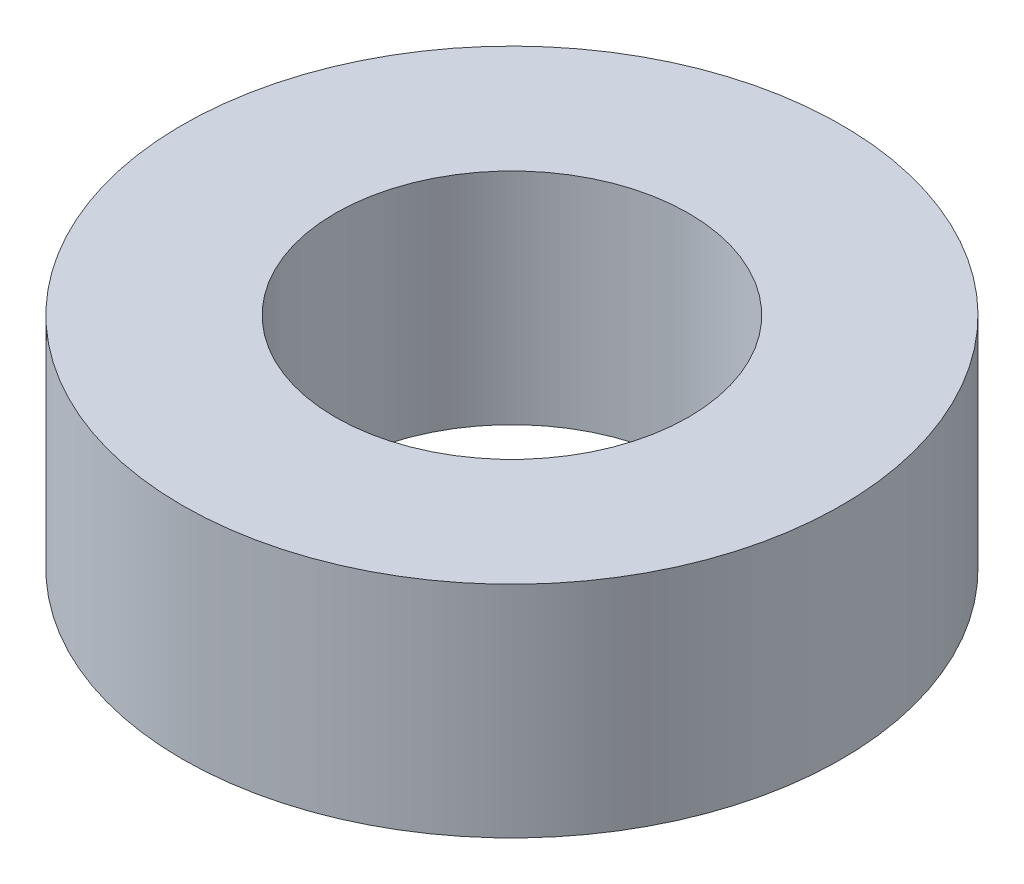
ISO-10303-21;
HEADER;
FILE_DESCRIPTION(('STEP AP214'),'2;1');
FILE_NAME('part.step','',(''),(''),'','','');
FILE_SCHEMA(('AUTOMOTIVE_DESIGN { 1 0 10303 214 1 1 1 1 }'));
ENDSEC;
DATA;
#1=APPLICATION_CONTEXT('core data for automotive mechanical design processes');
#2=APPLICATION_PROTOCOL_DEFINITION('international standard','automotive_design',2000,#1);
#3=PRODUCT_CONTEXT('',#1,'mechanical');
#4=PRODUCT('Part','Part','',(#3));
#5=PRODUCT_RELATED_PRODUCT_CATEGORY('part','',(#4));
#6=PRODUCT_DEFINITION_FORMATION('','',#4);
#7=PRODUCT_DEFINITION_CONTEXT('part definition',#1,'design');
#8=PRODUCT_DEFINITION('design','',#6,#7);
#9=PRODUCT_DEFINITION_SHAPE('','',#8);
#10=(LENGTH_UNIT() NAMED_UNIT(*) SI_UNIT(.MILLI.,.METRE.));
#11=(NAMED_UNIT(*) PLANE_ANGLE_UNIT() SI_UNIT($,.RADIAN.));
#12=(NAMED_UNIT(*) SI_UNIT($,.STERADIAN.) SOLID_ANGLE_UNIT());
#13=UNCERTAINTY_MEASURE_WITH_UNIT(LENGTH_MEASURE(1.E-05),#10,'distance_accuracy_value','');
#14=(GEOMETRIC_REPRESENTATION_CONTEXT(3) GLOBAL_UNCERTAINTY_ASSIGNED_CONTEXT((#13)) GLOBAL_UNIT_ASSIGNED_CONTEXT((#10,
#11,#12)) REPRESENTATION_CONTEXT('',''));
#15=CARTESIAN_POINT('',(0.,0.,0.));
#16=DIRECTION('',(0.,0.,1.));
#17=DIRECTION('',(1.,0.,0.));
#18=AXIS2_PLACEMENT_3D('',#15,#16,#17);
#19=CARTESIAN_POINT('',(0.,1.5875,0.));
#20=DIRECTION('',(0.,1.,0.));
#21=DIRECTION('',(0.,0.,1.));
#22=AXIS2_PLACEMENT_3D('',#19,#20,#21);
#23=PLANE('',#22);
#24=CARTESIAN_POINT('',(0.,1.5875,0.));
#25=DIRECTION('',(0.,1.,0.));
#26=DIRECTION('',(0.,0.,1.));
#27=AXIS2_PLACEMENT_3D('',#24,#25,#26);
#28=CIRCLE('',#27,4.7625);
#29=CARTESIAN_POINT('',(0.,1.5875,4.7625));
#30=VERTEX_POINT('',#29);
#31=EDGE_CURVE('E10',#30,#30,#28,.T.);
#32=ORIENTED_EDGE('',*,*,#31,.T.);
#33=EDGE_LOOP('',(#32));
#34=FACE_BOUND('',#33,.T.);
#35=CARTESIAN_POINT('',(0.,1.5875,0.));
#36=DIRECTION('',(0.,1.,0.));
#37=DIRECTION('',(0.,0.,1.));
#38=AXIS2_PLACEMENT_3D('',#35,#36,#37);
#39=CIRCLE('',#38,2.5527);
#40=CARTESIAN_POINT('',(0.,1.5875,2.5527));
#41=VERTEX_POINT('',#40);
#42=EDGE_CURVE('E42',#41,#41,#39,.T.);
#43=ORIENTED_EDGE('',*,*,#42,.F.);
#44=EDGE_LOOP('',(#43));
#45=FACE_BOUND('',#44,.T.);
#46=ADVANCED_FACE('F31',(#34,#45),#23,.T.);
#47=CARTESIAN_POINT('',(0.,-1.5875,0.));
#48=DIRECTION('',(0.,1.,0.));
#49=DIRECTION('',(0.,0.,1.));
#50=AXIS2_PLACEMENT_3D('',#47,#48,#49);
#51=PLANE('',#50);
#52=CARTESIAN_POINT('',(0.,-1.5875,0.));
#53=DIRECTION('',(0.,1.,0.));
#54=DIRECTION('',(0.,0.,1.));
#55=AXIS2_PLACEMENT_3D('',#52,#53,#54);
#56=CIRCLE('',#55,4.7625);
#57=CARTESIAN_POINT('',(0.,-1.5875,4.7625));
#58=VERTEX_POINT('',#57);
#59=EDGE_CURVE('E35',#58,#58,#56,.T.);
#60=ORIENTED_EDGE('',*,*,#59,.F.);
#61=EDGE_LOOP('',(#60));
#62=FACE_BOUND('',#61,.T.);
#63=CARTESIAN_POINT('',(0.,-1.5875,0.));
#64=DIRECTION('',(0.,1.,0.));
#65=DIRECTION('',(0.,0.,1.));
#66=AXIS2_PLACEMENT_3D('',#63,#64,#65);
#67=CIRCLE('',#66,2.5527);
#68=CARTESIAN_POINT('',(0.,-1.5875,2.5527));
#69=VERTEX_POINT('',#68);
#70=EDGE_CURVE('E44',#69,#69,#67,.T.);
#71=ORIENTED_EDGE('',*,*,#70,.T.);
#72=EDGE_LOOP('',(#71));
#73=FACE_BOUND('',#72,.T.);
#74=ADVANCED_FACE('F54',(#62,#73),#51,.F.);
#75=CARTESIAN_POINT('',(0.,1.5875,0.));
#76=DIRECTION('',(0.,-1.,0.));
#77=DIRECTION('',(0.,0.,-1.));
#78=AXIS2_PLACEMENT_3D('',#75,#76,#77);
#79=CYLINDRICAL_SURFACE('',#78,4.7625);
#80=ORIENTED_EDGE('',*,*,#31,.F.);
#81=EDGE_LOOP('',(#80));
#82=FACE_BOUND('',#81,.T.);
#83=ORIENTED_EDGE('',*,*,#59,.T.);
#84=EDGE_LOOP('',(#83));
#85=FACE_BOUND('',#84,.T.);
#86=ADVANCED_FACE('F33',(#82,#85),#79,.T.);
#87=CARTESIAN_POINT('',(0.,1.5875,0.));
#88=DIRECTION('',(0.,-1.,0.));
#89=DIRECTION('',(0.,0.,-1.));
#90=AXIS2_PLACEMENT_3D('',#87,#88,#89);
#91=CYLINDRICAL_SURFACE('',#90,2.5527);
#92=ORIENTED_EDGE('',*,*,#42,.T.);
#93=EDGE_LOOP('',(#92));
#94=FACE_BOUND('',#93,.T.);
#95=ORIENTED_EDGE('',*,*,#70,.F.);
#96=EDGE_LOOP('',(#95));
#97=FACE_BOUND('',#96,.T.);
#98=ADVANCED_FACE('F50',(#94,#97),#91,.F.);
#99=CLOSED_SHELL('',(#46,#74,#86,#98));
#100=MANIFOLD_SOLID_BREP('B2',#99);
#101=ADVANCED_BREP_SHAPE_REPRESENTATION('',(#18,#100),#14);
#102=SHAPE_DEFINITION_REPRESENTATION(#9,#101);
ENDSEC;
END-ISO-10303-21;
